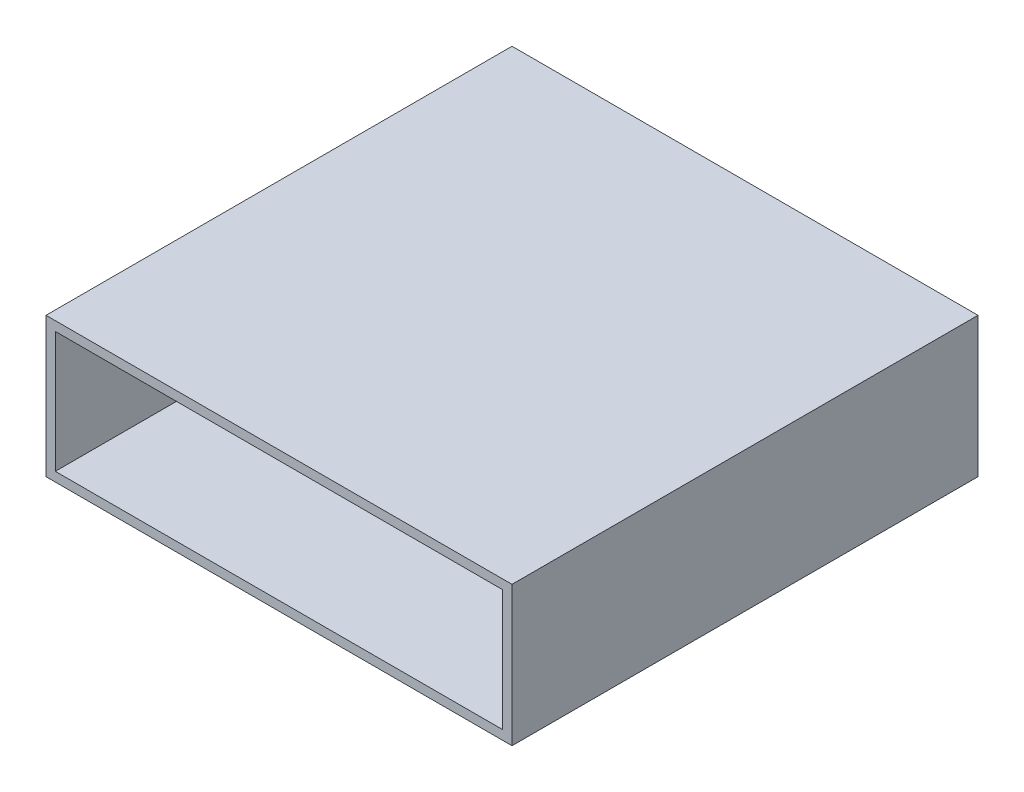
ISO-10303-21;
HEADER;
FILE_DESCRIPTION(('STEP AP214'),'2;1');
FILE_NAME('part.step','',(''),(''),'','','');
FILE_SCHEMA(('AUTOMOTIVE_DESIGN { 1 0 10303 214 1 1 1 1 }'));
ENDSEC;
DATA;
#1=APPLICATION_CONTEXT('core data for automotive mechanical design processes');
#2=APPLICATION_PROTOCOL_DEFINITION('international standard','automotive_design',2000,#1);
#3=PRODUCT_CONTEXT('',#1,'mechanical');
#4=PRODUCT('Part','Part','',(#3));
#5=PRODUCT_RELATED_PRODUCT_CATEGORY('part','',(#4));
#6=PRODUCT_DEFINITION_FORMATION('','',#4);
#7=PRODUCT_DEFINITION_CONTEXT('part definition',#1,'design');
#8=PRODUCT_DEFINITION('design','',#6,#7);
#9=PRODUCT_DEFINITION_SHAPE('','',#8);
#10=(LENGTH_UNIT() NAMED_UNIT(*) SI_UNIT(.MILLI.,.METRE.));
#11=(NAMED_UNIT(*) PLANE_ANGLE_UNIT() SI_UNIT($,.RADIAN.));
#12=(NAMED_UNIT(*) SI_UNIT($,.STERADIAN.) SOLID_ANGLE_UNIT());
#13=UNCERTAINTY_MEASURE_WITH_UNIT(LENGTH_MEASURE(1.E-05),#10,'distance_accuracy_value','');
#14=(GEOMETRIC_REPRESENTATION_CONTEXT(3) GLOBAL_UNCERTAINTY_ASSIGNED_CONTEXT((#13)) GLOBAL_UNIT_ASSIGNED_CONTEXT((#10,
#11,#12)) REPRESENTATION_CONTEXT('',''));
#15=CARTESIAN_POINT('',(0.,0.,0.));
#16=DIRECTION('',(0.,0.,1.));
#17=DIRECTION('',(1.,0.,0.));
#18=AXIS2_PLACEMENT_3D('',#15,#16,#17);
#19=CARTESIAN_POINT('',(0.,0.,50.));
#20=DIRECTION('',(0.,0.,-1.));
#21=DIRECTION('',(-1.,0.,0.));
#22=AXIS2_PLACEMENT_3D('',#19,#20,#21);
#23=PLANE('',#22);
#24=DIRECTION('',(0.,-1.,0.));
#25=VECTOR('',#24,1.);
#26=CARTESIAN_POINT('',(0.,0.,50.));
#27=LINE('',#26,#25);
#28=CARTESIAN_POINT('',(0.,15.,50.));
#29=VERTEX_POINT('',#28);
#30=CARTESIAN_POINT('',(0.,0.,50.));
#31=VERTEX_POINT('',#30);
#32=EDGE_CURVE('E136',#29,#31,#27,.T.);
#33=ORIENTED_EDGE('',*,*,#32,.T.);
#34=DIRECTION('',(1.,0.,0.));
#35=VECTOR('',#34,1.);
#36=CARTESIAN_POINT('',(0.,0.,50.));
#37=LINE('',#36,#35);
#38=CARTESIAN_POINT('',(50.,0.,50.));
#39=VERTEX_POINT('',#38);
#40=EDGE_CURVE('E139',#31,#39,#37,.T.);
#41=ORIENTED_EDGE('',*,*,#40,.T.);
#42=DIRECTION('',(0.,1.,0.));
#43=VECTOR('',#42,1.);
#44=CARTESIAN_POINT('',(50.,0.,50.));
#45=LINE('',#44,#43);
#46=CARTESIAN_POINT('',(50.,15.,50.));
#47=VERTEX_POINT('',#46);
#48=EDGE_CURVE('E142',#39,#47,#45,.T.);
#49=ORIENTED_EDGE('',*,*,#48,.T.);
#50=DIRECTION('',(-1.,0.,0.));
#51=VECTOR('',#50,1.);
#52=CARTESIAN_POINT('',(0.,15.,50.));
#53=LINE('',#52,#51);
#54=EDGE_CURVE('E144',#47,#29,#53,.T.);
#55=ORIENTED_EDGE('',*,*,#54,.T.);
#56=EDGE_LOOP('',(#33,#41,#49,#55));
#57=FACE_BOUND('',#56,.T.);
#58=DIRECTION('',(0.,-1.,0.));
#59=VECTOR('',#58,1.);
#60=CARTESIAN_POINT('',(1.,1.,50.));
#61=LINE('',#60,#59);
#62=CARTESIAN_POINT('',(1.,14.,50.));
#63=VERTEX_POINT('',#62);
#64=CARTESIAN_POINT('',(1.,1.,50.));
#65=VERTEX_POINT('',#64);
#66=EDGE_CURVE('E100',#63,#65,#61,.T.);
#67=ORIENTED_EDGE('',*,*,#66,.F.);
#68=DIRECTION('',(-1.,0.,0.));
#69=VECTOR('',#68,1.);
#70=CARTESIAN_POINT('',(1.,14.,50.));
#71=LINE('',#70,#69);
#72=CARTESIAN_POINT('',(49.,14.,50.));
#73=VERTEX_POINT('',#72);
#74=EDGE_CURVE('E122',#73,#63,#71,.T.);
#75=ORIENTED_EDGE('',*,*,#74,.F.);
#76=DIRECTION('',(0.,1.,0.));
#77=VECTOR('',#76,1.);
#78=CARTESIAN_POINT('',(49.,1.,50.));
#79=LINE('',#78,#77);
#80=CARTESIAN_POINT('',(49.,1.,50.));
#81=VERTEX_POINT('',#80);
#82=EDGE_CURVE('E120',#81,#73,#79,.T.);
#83=ORIENTED_EDGE('',*,*,#82,.F.);
#84=DIRECTION('',(1.,0.,0.));
#85=VECTOR('',#84,1.);
#86=CARTESIAN_POINT('',(1.,1.,50.));
#87=LINE('',#86,#85);
#88=EDGE_CURVE('E108',#65,#81,#87,.T.);
#89=ORIENTED_EDGE('',*,*,#88,.F.);
#90=EDGE_LOOP('',(#67,#75,#83,#89));
#91=FACE_BOUND('',#90,.T.);
#92=ADVANCED_FACE('F35',(#57,#91),#23,.F.);
#93=CARTESIAN_POINT('',(0.,0.,0.));
#94=DIRECTION('',(0.,0.,-1.));
#95=DIRECTION('',(-1.,0.,0.));
#96=AXIS2_PLACEMENT_3D('',#93,#94,#95);
#97=PLANE('',#96);
#98=DIRECTION('',(0.,-1.,0.));
#99=VECTOR('',#98,1.);
#100=CARTESIAN_POINT('',(0.,0.,0.));
#101=LINE('',#100,#99);
#102=CARTESIAN_POINT('',(0.,15.,0.));
#103=VERTEX_POINT('',#102);
#104=CARTESIAN_POINT('',(0.,0.,0.));
#105=VERTEX_POINT('',#104);
#106=EDGE_CURVE('E116',#103,#105,#101,.T.);
#107=ORIENTED_EDGE('',*,*,#106,.F.);
#108=DIRECTION('',(-1.,0.,0.));
#109=VECTOR('',#108,1.);
#110=CARTESIAN_POINT('',(0.,15.,0.));
#111=LINE('',#110,#109);
#112=CARTESIAN_POINT('',(50.,15.,0.));
#113=VERTEX_POINT('',#112);
#114=EDGE_CURVE('E140',#113,#103,#111,.T.);
#115=ORIENTED_EDGE('',*,*,#114,.F.);
#116=DIRECTION('',(0.,1.,0.));
#117=VECTOR('',#116,1.);
#118=CARTESIAN_POINT('',(50.,0.,0.));
#119=LINE('',#118,#117);
#120=CARTESIAN_POINT('',(50.,0.,0.));
#121=VERTEX_POINT('',#120);
#122=EDGE_CURVE('E151',#121,#113,#119,.T.);
#123=ORIENTED_EDGE('',*,*,#122,.F.);
#124=DIRECTION('',(1.,0.,0.));
#125=VECTOR('',#124,1.);
#126=CARTESIAN_POINT('',(0.,0.,0.));
#127=LINE('',#126,#125);
#128=EDGE_CURVE('E149',#105,#121,#127,.T.);
#129=ORIENTED_EDGE('',*,*,#128,.F.);
#130=EDGE_LOOP('',(#107,#115,#123,#129));
#131=FACE_BOUND('',#130,.T.);
#132=DIRECTION('',(-1.,0.,0.));
#133=VECTOR('',#132,1.);
#134=CARTESIAN_POINT('',(1.,14.,0.));
#135=LINE('',#134,#133);
#136=CARTESIAN_POINT('',(49.,14.,0.));
#137=VERTEX_POINT('',#136);
#138=CARTESIAN_POINT('',(1.,14.,0.));
#139=VERTEX_POINT('',#138);
#140=EDGE_CURVE('E109',#137,#139,#135,.T.);
#141=ORIENTED_EDGE('',*,*,#140,.T.);
#142=DIRECTION('',(0.,-1.,0.));
#143=VECTOR('',#142,1.);
#144=CARTESIAN_POINT('',(1.,1.,0.));
#145=LINE('',#144,#143);
#146=CARTESIAN_POINT('',(1.,1.,0.));
#147=VERTEX_POINT('',#146);
#148=EDGE_CURVE('E58',#139,#147,#145,.T.);
#149=ORIENTED_EDGE('',*,*,#148,.T.);
#150=DIRECTION('',(1.,0.,0.));
#151=VECTOR('',#150,1.);
#152=CARTESIAN_POINT('',(1.,1.,0.));
#153=LINE('',#152,#151);
#154=CARTESIAN_POINT('',(49.,1.,0.));
#155=VERTEX_POINT('',#154);
#156=EDGE_CURVE('E115',#147,#155,#153,.T.);
#157=ORIENTED_EDGE('',*,*,#156,.T.);
#158=DIRECTION('',(0.,1.,0.));
#159=VECTOR('',#158,1.);
#160=CARTESIAN_POINT('',(49.,1.,0.));
#161=LINE('',#160,#159);
#162=EDGE_CURVE('E128',#155,#137,#161,.T.);
#163=ORIENTED_EDGE('',*,*,#162,.T.);
#164=EDGE_LOOP('',(#141,#149,#157,#163));
#165=FACE_BOUND('',#164,.T.);
#166=ADVANCED_FACE('F169',(#131,#165),#97,.T.);
#167=CARTESIAN_POINT('',(0.,0.,50.));
#168=DIRECTION('',(1.,0.,0.));
#169=DIRECTION('',(0.,0.,-1.));
#170=AXIS2_PLACEMENT_3D('',#167,#168,#169);
#171=PLANE('',#170);
#172=ORIENTED_EDGE('',*,*,#106,.T.);
#173=DIRECTION('',(0.,0.,-1.));
#174=VECTOR('',#173,1.);
#175=CARTESIAN_POINT('',(0.,0.,50.));
#176=LINE('',#175,#174);
#177=EDGE_CURVE('E11',#31,#105,#176,.T.);
#178=ORIENTED_EDGE('',*,*,#177,.F.);
#179=ORIENTED_EDGE('',*,*,#32,.F.);
#180=DIRECTION('',(0.,0.,-1.));
#181=VECTOR('',#180,1.);
#182=CARTESIAN_POINT('',(0.,15.,50.));
#183=LINE('',#182,#181);
#184=EDGE_CURVE('E146',#29,#103,#183,.T.);
#185=ORIENTED_EDGE('',*,*,#184,.T.);
#186=EDGE_LOOP('',(#172,#178,#179,#185));
#187=FACE_BOUND('',#186,.T.);
#188=ADVANCED_FACE('F37',(#187),#171,.F.);
#189=CARTESIAN_POINT('',(0.,0.,50.));
#190=DIRECTION('',(0.,1.,0.));
#191=DIRECTION('',(0.,0.,1.));
#192=AXIS2_PLACEMENT_3D('',#189,#190,#191);
#193=PLANE('',#192);
#194=ORIENTED_EDGE('',*,*,#128,.T.);
#195=DIRECTION('',(0.,0.,-1.));
#196=VECTOR('',#195,1.);
#197=CARTESIAN_POINT('',(50.,0.,50.));
#198=LINE('',#197,#196);
#199=EDGE_CURVE('E43',#39,#121,#198,.T.);
#200=ORIENTED_EDGE('',*,*,#199,.F.);
#201=ORIENTED_EDGE('',*,*,#40,.F.);
#202=ORIENTED_EDGE('',*,*,#177,.T.);
#203=EDGE_LOOP('',(#194,#200,#201,#202));
#204=FACE_BOUND('',#203,.T.);
#205=ADVANCED_FACE('F179',(#204),#193,.F.);
#206=CARTESIAN_POINT('',(50.,0.,50.));
#207=DIRECTION('',(-1.,0.,0.));
#208=DIRECTION('',(0.,0.,1.));
#209=AXIS2_PLACEMENT_3D('',#206,#207,#208);
#210=PLANE('',#209);
#211=ORIENTED_EDGE('',*,*,#122,.T.);
#212=DIRECTION('',(0.,0.,-1.));
#213=VECTOR('',#212,1.);
#214=CARTESIAN_POINT('',(50.,15.,50.));
#215=LINE('',#214,#213);
#216=EDGE_CURVE('E156',#47,#113,#215,.T.);
#217=ORIENTED_EDGE('',*,*,#216,.F.);
#218=ORIENTED_EDGE('',*,*,#48,.F.);
#219=ORIENTED_EDGE('',*,*,#199,.T.);
#220=EDGE_LOOP('',(#211,#217,#218,#219));
#221=FACE_BOUND('',#220,.T.);
#222=ADVANCED_FACE('F163',(#221),#210,.F.);
#223=CARTESIAN_POINT('',(0.,15.,50.));
#224=DIRECTION('',(0.,-1.,0.));
#225=DIRECTION('',(0.,0.,-1.));
#226=AXIS2_PLACEMENT_3D('',#223,#224,#225);
#227=PLANE('',#226);
#228=ORIENTED_EDGE('',*,*,#114,.T.);
#229=ORIENTED_EDGE('',*,*,#184,.F.);
#230=ORIENTED_EDGE('',*,*,#54,.F.);
#231=ORIENTED_EDGE('',*,*,#216,.T.);
#232=EDGE_LOOP('',(#228,#229,#230,#231));
#233=FACE_BOUND('',#232,.T.);
#234=ADVANCED_FACE('F173',(#233),#227,.F.);
#235=CARTESIAN_POINT('',(1.,1.,50.));
#236=DIRECTION('',(1.,0.,0.));
#237=DIRECTION('',(0.,0.,-1.));
#238=AXIS2_PLACEMENT_3D('',#235,#236,#237);
#239=PLANE('',#238);
#240=ORIENTED_EDGE('',*,*,#148,.F.);
#241=DIRECTION('',(0.,0.,-1.));
#242=VECTOR('',#241,1.);
#243=CARTESIAN_POINT('',(1.,14.,50.));
#244=LINE('',#243,#242);
#245=EDGE_CURVE('E104',#63,#139,#244,.T.);
#246=ORIENTED_EDGE('',*,*,#245,.F.);
#247=ORIENTED_EDGE('',*,*,#66,.T.);
#248=DIRECTION('',(0.,0.,-1.));
#249=VECTOR('',#248,1.);
#250=CARTESIAN_POINT('',(1.,1.,50.));
#251=LINE('',#250,#249);
#252=EDGE_CURVE('E103',#65,#147,#251,.T.);
#253=ORIENTED_EDGE('',*,*,#252,.T.);
#254=EDGE_LOOP('',(#240,#246,#247,#253));
#255=FACE_BOUND('',#254,.T.);
#256=ADVANCED_FACE('F102',(#255),#239,.T.);
#257=CARTESIAN_POINT('',(1.,1.,50.));
#258=DIRECTION('',(0.,1.,0.));
#259=DIRECTION('',(0.,0.,1.));
#260=AXIS2_PLACEMENT_3D('',#257,#258,#259);
#261=PLANE('',#260);
#262=ORIENTED_EDGE('',*,*,#156,.F.);
#263=ORIENTED_EDGE('',*,*,#252,.F.);
#264=ORIENTED_EDGE('',*,*,#88,.T.);
#265=DIRECTION('',(0.,0.,-1.));
#266=VECTOR('',#265,1.);
#267=CARTESIAN_POINT('',(49.,1.,50.));
#268=LINE('',#267,#266);
#269=EDGE_CURVE('E117',#81,#155,#268,.T.);
#270=ORIENTED_EDGE('',*,*,#269,.T.);
#271=EDGE_LOOP('',(#262,#263,#264,#270));
#272=FACE_BOUND('',#271,.T.);
#273=ADVANCED_FACE('F112',(#272),#261,.T.);
#274=CARTESIAN_POINT('',(49.,1.,50.));
#275=DIRECTION('',(-1.,0.,0.));
#276=DIRECTION('',(0.,0.,1.));
#277=AXIS2_PLACEMENT_3D('',#274,#275,#276);
#278=PLANE('',#277);
#279=ORIENTED_EDGE('',*,*,#162,.F.);
#280=ORIENTED_EDGE('',*,*,#269,.F.);
#281=ORIENTED_EDGE('',*,*,#82,.T.);
#282=DIRECTION('',(0.,0.,-1.));
#283=VECTOR('',#282,1.);
#284=CARTESIAN_POINT('',(49.,14.,50.));
#285=LINE('',#284,#283);
#286=EDGE_CURVE('E50',#73,#137,#285,.T.);
#287=ORIENTED_EDGE('',*,*,#286,.T.);
#288=EDGE_LOOP('',(#279,#280,#281,#287));
#289=FACE_BOUND('',#288,.T.);
#290=ADVANCED_FACE('F202',(#289),#278,.T.);
#291=CARTESIAN_POINT('',(1.,14.,50.));
#292=DIRECTION('',(0.,-1.,0.));
#293=DIRECTION('',(0.,0.,-1.));
#294=AXIS2_PLACEMENT_3D('',#291,#292,#293);
#295=PLANE('',#294);
#296=ORIENTED_EDGE('',*,*,#140,.F.);
#297=ORIENTED_EDGE('',*,*,#286,.F.);
#298=ORIENTED_EDGE('',*,*,#74,.T.);
#299=ORIENTED_EDGE('',*,*,#245,.T.);
#300=EDGE_LOOP('',(#296,#297,#298,#299));
#301=FACE_BOUND('',#300,.T.);
#302=ADVANCED_FACE('F206',(#301),#295,.T.);
#303=CLOSED_SHELL('',(#92,#166,#188,#205,#222,#234,#256,#273,#290,#302));
#304=MANIFOLD_SOLID_BREP('B2',#303);
#305=ADVANCED_BREP_SHAPE_REPRESENTATION('',(#18,#304),#14);
#306=SHAPE_DEFINITION_REPRESENTATION(#9,#305);
ENDSEC;
END-ISO-10303-21;
